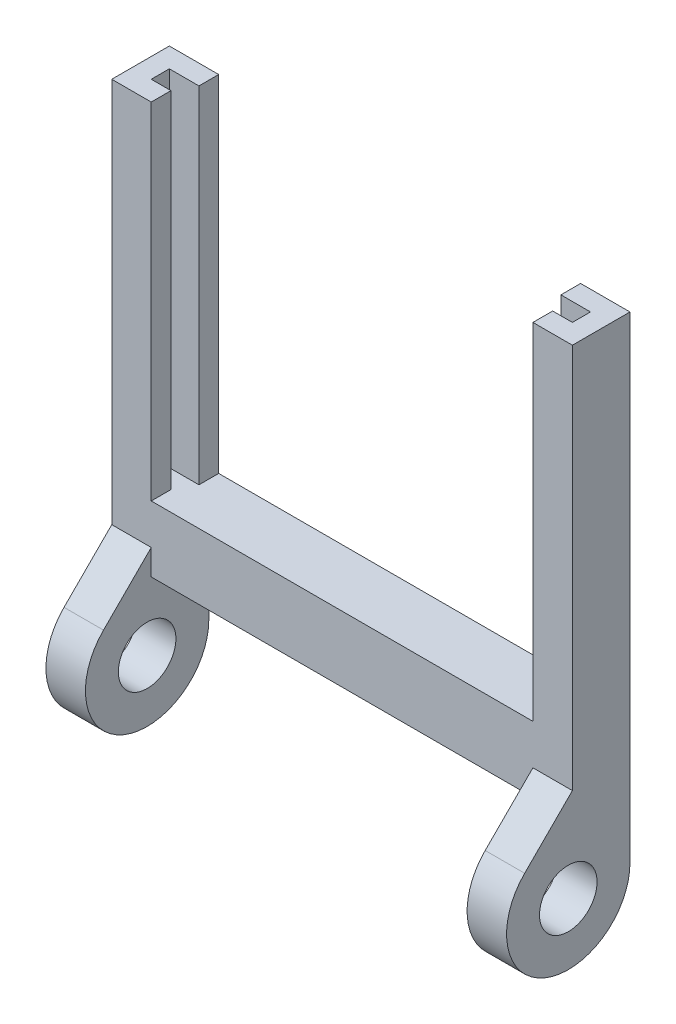
ISO-10303-21;
HEADER;
FILE_DESCRIPTION(('STEP AP214'),'2;1');
FILE_NAME('part.step','',(''),(''),'','','');
FILE_SCHEMA(('AUTOMOTIVE_DESIGN { 1 0 10303 214 1 1 1 1 }'));
ENDSEC;
DATA;
#1=APPLICATION_CONTEXT('core data for automotive mechanical design processes');
#2=APPLICATION_PROTOCOL_DEFINITION('international standard','automotive_design',2000,#1);
#3=PRODUCT_CONTEXT('',#1,'mechanical');
#4=PRODUCT('Part','Part','',(#3));
#5=PRODUCT_RELATED_PRODUCT_CATEGORY('part','',(#4));
#6=PRODUCT_DEFINITION_FORMATION('','',#4);
#7=PRODUCT_DEFINITION_CONTEXT('part definition',#1,'design');
#8=PRODUCT_DEFINITION('design','',#6,#7);
#9=PRODUCT_DEFINITION_SHAPE('','',#8);
#10=(LENGTH_UNIT() NAMED_UNIT(*) SI_UNIT(.MILLI.,.METRE.));
#11=(NAMED_UNIT(*) PLANE_ANGLE_UNIT() SI_UNIT($,.RADIAN.));
#12=(NAMED_UNIT(*) SI_UNIT($,.STERADIAN.) SOLID_ANGLE_UNIT());
#13=UNCERTAINTY_MEASURE_WITH_UNIT(LENGTH_MEASURE(1.E-05),#10,'distance_accuracy_value','');
#14=(GEOMETRIC_REPRESENTATION_CONTEXT(3) GLOBAL_UNCERTAINTY_ASSIGNED_CONTEXT((#13)) GLOBAL_UNIT_ASSIGNED_CONTEXT((#10,
#11,#12)) REPRESENTATION_CONTEXT('',''));
#15=CARTESIAN_POINT('',(0.,0.,0.));
#16=DIRECTION('',(0.,0.,1.));
#17=DIRECTION('',(1.,0.,0.));
#18=AXIS2_PLACEMENT_3D('',#15,#16,#17);
#19=CARTESIAN_POINT('',(0.,0.,1.2));
#20=DIRECTION('',(0.,0.,-1.));
#21=DIRECTION('',(-1.,0.,0.));
#22=AXIS2_PLACEMENT_3D('',#19,#20,#21);
#23=PLANE('',#22);
#24=DIRECTION('',(-1.,0.,0.));
#25=VECTOR('',#24,1.);
#26=CARTESIAN_POINT('',(-14.,-8.5,1.2));
#27=LINE('',#26,#25);
#28=CARTESIAN_POINT('',(12.8,-8.5,1.2));
#29=VERTEX_POINT('',#28);
#30=CARTESIAN_POINT('',(11.,-8.5,1.2));
#31=VERTEX_POINT('',#30);
#32=EDGE_CURVE('E222',#29,#31,#27,.T.);
#33=ORIENTED_EDGE('',*,*,#32,.F.);
#34=DIRECTION('',(0.,1.,0.));
#35=VECTOR('',#34,1.);
#36=CARTESIAN_POINT('',(12.8,-13.9708531688199,1.2));
#37=LINE('',#36,#35);
#38=CARTESIAN_POINT('',(12.8,12.5,1.2));
#39=VERTEX_POINT('',#38);
#40=EDGE_CURVE('E308',#29,#39,#37,.T.);
#41=ORIENTED_EDGE('',*,*,#40,.T.);
#42=DIRECTION('',(-1.,0.,0.));
#43=VECTOR('',#42,1.);
#44=CARTESIAN_POINT('',(-14.,12.5,1.2));
#45=LINE('',#44,#43);
#46=CARTESIAN_POINT('',(11.,12.5,1.2));
#47=VERTEX_POINT('',#46);
#48=EDGE_CURVE('E372',#39,#47,#45,.T.);
#49=ORIENTED_EDGE('',*,*,#48,.T.);
#50=DIRECTION('',(0.,1.,0.));
#51=VECTOR('',#50,1.);
#52=CARTESIAN_POINT('',(11.,12.5,1.2));
#53=LINE('',#52,#51);
#54=EDGE_CURVE('E351',#31,#47,#53,.T.);
#55=ORIENTED_EDGE('',*,*,#54,.F.);
#56=EDGE_LOOP('',(#33,#41,#49,#55));
#57=FACE_BOUND('',#56,.T.);
#58=ADVANCED_FACE('F37',(#57),#23,.F.);
#59=CARTESIAN_POINT('',(-11.,-8.5,1.2));
#60=VERTEX_POINT('',#59);
#61=CARTESIAN_POINT('',(-12.8,-8.5,1.2));
#62=VERTEX_POINT('',#61);
#63=EDGE_CURVE('E216',#60,#62,#27,.T.);
#64=ORIENTED_EDGE('',*,*,#63,.F.);
#65=DIRECTION('',(0.,-1.,0.));
#66=VECTOR('',#65,1.);
#67=CARTESIAN_POINT('',(-11.,12.5,1.2));
#68=LINE('',#67,#66);
#69=CARTESIAN_POINT('',(-11.,12.5,1.2));
#70=VERTEX_POINT('',#69);
#71=EDGE_CURVE('E344',#70,#60,#68,.T.);
#72=ORIENTED_EDGE('',*,*,#71,.F.);
#73=CARTESIAN_POINT('',(-12.8,12.5,1.2));
#74=VERTEX_POINT('',#73);
#75=EDGE_CURVE('E376',#70,#74,#45,.T.);
#76=ORIENTED_EDGE('',*,*,#75,.T.);
#77=DIRECTION('',(0.,1.,0.));
#78=VECTOR('',#77,1.);
#79=CARTESIAN_POINT('',(-12.8,-13.9708531688199,1.2));
#80=LINE('',#79,#78);
#81=EDGE_CURVE('E201',#62,#74,#80,.T.);
#82=ORIENTED_EDGE('',*,*,#81,.F.);
#83=EDGE_LOOP('',(#64,#72,#76,#82));
#84=FACE_BOUND('',#83,.T.);
#85=ADVANCED_FACE('F441',(#84),#23,.F.);
#86=CARTESIAN_POINT('',(11.6,-13.8483495705504,6.40165042944954));
#87=DIRECTION('',(0.,0.707106781186551,0.707106781186544));
#88=DIRECTION('',(0.,-0.707106781186544,0.707106781186551));
#89=AXIS2_PLACEMENT_3D('',#86,#87,#88);
#90=PLANE('',#89);
#91=DIRECTION('',(0.,-0.707106781186544,0.707106781186551));
#92=VECTOR('',#91,1.);
#93=CARTESIAN_POINT('',(14.,-13.8483495705504,6.40165042944954));
#94=LINE('',#93,#92);
#95=CARTESIAN_POINT('',(14.,-10.9466991411009,3.5));
#96=VERTEX_POINT('',#95);
#97=CARTESIAN_POINT('',(14.,-13.8483495705504,6.40165042944954));
#98=VERTEX_POINT('',#97);
#99=EDGE_CURVE('E324',#96,#98,#94,.T.);
#100=ORIENTED_EDGE('',*,*,#99,.F.);
#101=DIRECTION('',(-1.,0.,0.));
#102=VECTOR('',#101,1.);
#103=CARTESIAN_POINT('',(11.6,-10.9466991411009,3.5));
#104=LINE('',#103,#102);
#105=CARTESIAN_POINT('',(11.6,-10.9466991411009,3.5));
#106=VERTEX_POINT('',#105);
#107=EDGE_CURVE('E247',#96,#106,#104,.T.);
#108=ORIENTED_EDGE('',*,*,#107,.T.);
#109=DIRECTION('',(0.,-0.707106781186544,0.707106781186551));
#110=VECTOR('',#109,1.);
#111=CARTESIAN_POINT('',(11.6,-13.8483495705504,6.40165042944954));
#112=LINE('',#111,#110);
#113=CARTESIAN_POINT('',(11.6,-13.8483495705504,6.40165042944954));
#114=VERTEX_POINT('',#113);
#115=EDGE_CURVE('E328',#106,#114,#112,.T.);
#116=ORIENTED_EDGE('',*,*,#115,.T.);
#117=DIRECTION('',(1.,0.,0.));
#118=VECTOR('',#117,1.);
#119=CARTESIAN_POINT('',(11.6,-13.8483495705504,6.40165042944954));
#120=LINE('',#119,#118);
#121=EDGE_CURVE('E337',#114,#98,#120,.T.);
#122=ORIENTED_EDGE('',*,*,#121,.T.);
#123=EDGE_LOOP('',(#100,#108,#116,#122));
#124=FACE_BOUND('',#123,.T.);
#125=ADVANCED_FACE('F466',(#124),#90,.T.);
#126=CARTESIAN_POINT('',(11.6,-16.5,3.75));
#127=DIRECTION('',(1.,0.,0.));
#128=DIRECTION('',(0.,0.,-1.));
#129=AXIS2_PLACEMENT_3D('',#126,#127,#128);
#130=PLANE('',#129);
#131=DIRECTION('',(0.,0.,-1.));
#132=VECTOR('',#131,1.);
#133=CARTESIAN_POINT('',(11.6,-8.5,3.75));
#134=LINE('',#133,#132);
#135=CARTESIAN_POINT('',(11.6,-8.5,3.5));
#136=VERTEX_POINT('',#135);
#137=CARTESIAN_POINT('',(11.6,-8.5,2.3));
#138=VERTEX_POINT('',#137);
#139=EDGE_CURVE('E235',#136,#138,#134,.T.);
#140=ORIENTED_EDGE('',*,*,#139,.F.);
#141=DIRECTION('',(0.,1.,0.));
#142=VECTOR('',#141,1.);
#143=CARTESIAN_POINT('',(11.6,-13.9708531688199,3.5));
#144=LINE('',#143,#142);
#145=CARTESIAN_POINT('',(11.6,12.5,3.5));
#146=VERTEX_POINT('',#145);
#147=EDGE_CURVE('E311',#136,#146,#144,.T.);
#148=ORIENTED_EDGE('',*,*,#147,.T.);
#149=DIRECTION('',(0.,0.,1.));
#150=VECTOR('',#149,1.);
#151=CARTESIAN_POINT('',(11.6,12.5,3.5));
#152=LINE('',#151,#150);
#153=CARTESIAN_POINT('',(11.6,12.5,2.3));
#154=VERTEX_POINT('',#153);
#155=EDGE_CURVE('E300',#154,#146,#152,.T.);
#156=ORIENTED_EDGE('',*,*,#155,.F.);
#157=DIRECTION('',(0.,1.,0.));
#158=VECTOR('',#157,1.);
#159=CARTESIAN_POINT('',(11.6,-13.9708531688199,2.3));
#160=LINE('',#159,#158);
#161=EDGE_CURVE('E314',#138,#154,#160,.T.);
#162=ORIENTED_EDGE('',*,*,#161,.F.);
#163=EDGE_LOOP('',(#140,#148,#156,#162));
#164=FACE_BOUND('',#163,.T.);
#165=ADVANCED_FACE('F463',(#164),#130,.F.);
#166=CARTESIAN_POINT('',(11.6,-16.5,3.75));
#167=DIRECTION('',(1.,0.,0.));
#168=DIRECTION('',(0.,0.,-1.));
#169=AXIS2_PLACEMENT_3D('',#166,#167,#168);
#170=CIRCLE('',#169,1.75);
#171=CARTESIAN_POINT('',(11.6,-16.5,2.));
#172=VERTEX_POINT('',#171);
#173=EDGE_CURVE('E321',#172,#172,#170,.T.);
#174=ORIENTED_EDGE('',*,*,#173,.T.);
#175=EDGE_LOOP('',(#174));
#176=FACE_BOUND('',#175,.T.);
#177=DIRECTION('',(0.,1.,0.));
#178=VECTOR('',#177,1.);
#179=CARTESIAN_POINT('',(11.6,-16.5,3.5));
#180=LINE('',#179,#178);
#181=CARTESIAN_POINT('',(11.6,-12.5,3.5));
#182=VERTEX_POINT('',#181);
#183=EDGE_CURVE('E242',#182,#106,#180,.T.);
#184=ORIENTED_EDGE('',*,*,#183,.F.);
#185=DIRECTION('',(0.,0.,1.));
#186=VECTOR('',#185,1.);
#187=CARTESIAN_POINT('',(11.6,-12.5,0.));
#188=LINE('',#187,#186);
#189=CARTESIAN_POINT('',(11.6,-12.5,0.));
#190=VERTEX_POINT('',#189);
#191=EDGE_CURVE('E60',#190,#182,#188,.T.);
#192=ORIENTED_EDGE('',*,*,#191,.F.);
#193=DIRECTION('',(0.,1.,0.));
#194=VECTOR('',#193,1.);
#195=CARTESIAN_POINT('',(11.6,-12.5,0.));
#196=LINE('',#195,#194);
#197=CARTESIAN_POINT('',(11.6,-16.5,0.));
#198=VERTEX_POINT('',#197);
#199=EDGE_CURVE('E334',#198,#190,#196,.T.);
#200=ORIENTED_EDGE('',*,*,#199,.F.);
#201=CARTESIAN_POINT('',(11.6,-16.5,3.75));
#202=DIRECTION('',(1.,0.,0.));
#203=DIRECTION('',(0.,0.,-1.));
#204=AXIS2_PLACEMENT_3D('',#201,#202,#203);
#205=CIRCLE('',#204,3.75);
#206=EDGE_CURVE('E331',#114,#198,#205,.T.);
#207=ORIENTED_EDGE('',*,*,#206,.F.);
#208=ORIENTED_EDGE('',*,*,#115,.F.);
#209=EDGE_LOOP('',(#184,#192,#200,#207,#208));
#210=FACE_BOUND('',#209,.T.);
#211=ADVANCED_FACE('F406',(#176,#210),#130,.F.);
#212=CARTESIAN_POINT('',(11.6,-13.9708531688199,2.3));
#213=DIRECTION('',(0.,0.,-1.));
#214=DIRECTION('',(-1.,0.,0.));
#215=AXIS2_PLACEMENT_3D('',#212,#213,#214);
#216=PLANE('',#215);
#217=DIRECTION('',(0.,1.,0.));
#218=VECTOR('',#217,1.);
#219=CARTESIAN_POINT('',(12.8,-13.9708531688199,2.3));
#220=LINE('',#219,#218);
#221=CARTESIAN_POINT('',(12.8,-8.5,2.3));
#222=VERTEX_POINT('',#221);
#223=CARTESIAN_POINT('',(12.8,12.5,2.3));
#224=VERTEX_POINT('',#223);
#225=EDGE_CURVE('E317',#222,#224,#220,.T.);
#226=ORIENTED_EDGE('',*,*,#225,.F.);
#227=DIRECTION('',(-1.,0.,0.));
#228=VECTOR('',#227,1.);
#229=CARTESIAN_POINT('',(11.6,-8.5,2.3));
#230=LINE('',#229,#228);
#231=EDGE_CURVE('E233',#222,#138,#230,.T.);
#232=ORIENTED_EDGE('',*,*,#231,.T.);
#233=ORIENTED_EDGE('',*,*,#161,.T.);
#234=DIRECTION('',(-1.,0.,0.));
#235=VECTOR('',#234,1.);
#236=CARTESIAN_POINT('',(11.6,12.5,2.3));
#237=LINE('',#236,#235);
#238=EDGE_CURVE('E296',#224,#154,#237,.T.);
#239=ORIENTED_EDGE('',*,*,#238,.F.);
#240=EDGE_LOOP('',(#226,#232,#233,#239));
#241=FACE_BOUND('',#240,.T.);
#242=ADVANCED_FACE('F459',(#241),#216,.T.);
#243=CARTESIAN_POINT('',(12.8,-13.9708531688199,2.3));
#244=DIRECTION('',(-1.,0.,0.));
#245=DIRECTION('',(0.,0.,1.));
#246=AXIS2_PLACEMENT_3D('',#243,#244,#245);
#247=PLANE('',#246);
#248=ORIENTED_EDGE('',*,*,#40,.F.);
#249=DIRECTION('',(0.,0.,1.));
#250=VECTOR('',#249,1.);
#251=CARTESIAN_POINT('',(12.8,-8.5,2.3));
#252=LINE('',#251,#250);
#253=EDGE_CURVE('E231',#29,#222,#252,.T.);
#254=ORIENTED_EDGE('',*,*,#253,.T.);
#255=ORIENTED_EDGE('',*,*,#225,.T.);
#256=DIRECTION('',(0.,0.,1.));
#257=VECTOR('',#256,1.);
#258=CARTESIAN_POINT('',(12.8,12.5,2.3));
#259=LINE('',#258,#257);
#260=EDGE_CURVE('E290',#39,#224,#259,.T.);
#261=ORIENTED_EDGE('',*,*,#260,.F.);
#262=EDGE_LOOP('',(#248,#254,#255,#261));
#263=FACE_BOUND('',#262,.T.);
#264=ADVANCED_FACE('F454',(#263),#247,.T.);
#265=CARTESIAN_POINT('',(-11.6,-16.5,3.75));
#266=DIRECTION('',(-1.,0.,0.));
#267=DIRECTION('',(0.,0.,-1.));
#268=AXIS2_PLACEMENT_3D('',#265,#266,#267);
#269=PLANE('',#268);
#270=DIRECTION('',(0.,0.,1.));
#271=VECTOR('',#270,1.);
#272=CARTESIAN_POINT('',(-11.6,-8.5,3.75));
#273=LINE('',#272,#271);
#274=CARTESIAN_POINT('',(-11.6,-8.5,2.3));
#275=VERTEX_POINT('',#274);
#276=CARTESIAN_POINT('',(-11.6,-8.5,3.5));
#277=VERTEX_POINT('',#276);
#278=EDGE_CURVE('E210',#275,#277,#273,.T.);
#279=ORIENTED_EDGE('',*,*,#278,.F.);
#280=DIRECTION('',(0.,1.,0.));
#281=VECTOR('',#280,1.);
#282=CARTESIAN_POINT('',(-11.6,-13.9708531688199,2.3));
#283=LINE('',#282,#281);
#284=CARTESIAN_POINT('',(-11.6,12.5,2.3));
#285=VERTEX_POINT('',#284);
#286=EDGE_CURVE('E202',#275,#285,#283,.T.);
#287=ORIENTED_EDGE('',*,*,#286,.T.);
#288=DIRECTION('',(0.,0.,1.));
#289=VECTOR('',#288,1.);
#290=CARTESIAN_POINT('',(-11.6,12.5,3.5));
#291=LINE('',#290,#289);
#292=CARTESIAN_POINT('',(-11.6,12.5,3.5));
#293=VERTEX_POINT('',#292);
#294=EDGE_CURVE('E252',#285,#293,#291,.T.);
#295=ORIENTED_EDGE('',*,*,#294,.T.);
#296=DIRECTION('',(0.,1.,0.));
#297=VECTOR('',#296,1.);
#298=CARTESIAN_POINT('',(-11.6,-13.9708531688199,3.5));
#299=LINE('',#298,#297);
#300=EDGE_CURVE('E263',#277,#293,#299,.T.);
#301=ORIENTED_EDGE('',*,*,#300,.F.);
#302=EDGE_LOOP('',(#279,#287,#295,#301));
#303=FACE_BOUND('',#302,.T.);
#304=ADVANCED_FACE('F439',(#303),#269,.F.);
#305=CARTESIAN_POINT('',(-11.6,-16.5,3.75));
#306=DIRECTION('',(1.,0.,0.));
#307=DIRECTION('',(0.,0.,-1.));
#308=AXIS2_PLACEMENT_3D('',#305,#306,#307);
#309=CIRCLE('',#308,1.75);
#310=CARTESIAN_POINT('',(-11.6,-16.5,2.));
#311=VERTEX_POINT('',#310);
#312=EDGE_CURVE('E267',#311,#311,#309,.T.);
#313=ORIENTED_EDGE('',*,*,#312,.F.);
#314=EDGE_LOOP('',(#313));
#315=FACE_BOUND('',#314,.T.);
#316=DIRECTION('',(0.,0.,1.));
#317=VECTOR('',#316,1.);
#318=CARTESIAN_POINT('',(-11.6,-12.5,0.));
#319=LINE('',#318,#317);
#320=CARTESIAN_POINT('',(-11.6,-12.5,0.));
#321=VERTEX_POINT('',#320);
#322=CARTESIAN_POINT('',(-11.6,-12.5,3.5));
#323=VERTEX_POINT('',#322);
#324=EDGE_CURVE('E273',#321,#323,#319,.T.);
#325=ORIENTED_EDGE('',*,*,#324,.T.);
#326=DIRECTION('',(0.,-1.,0.));
#327=VECTOR('',#326,1.);
#328=CARTESIAN_POINT('',(-11.6,-16.5,3.5));
#329=LINE('',#328,#327);
#330=CARTESIAN_POINT('',(-11.6,-10.9466991411009,3.5));
#331=VERTEX_POINT('',#330);
#332=EDGE_CURVE('E239',#331,#323,#329,.T.);
#333=ORIENTED_EDGE('',*,*,#332,.F.);
#334=DIRECTION('',(0.,-0.707106781186544,0.707106781186551));
#335=VECTOR('',#334,1.);
#336=CARTESIAN_POINT('',(-11.6,-13.8483495705504,6.40165042944954));
#337=LINE('',#336,#335);
#338=CARTESIAN_POINT('',(-11.6,-13.8483495705504,6.40165042944954));
#339=VERTEX_POINT('',#338);
#340=EDGE_CURVE('E281',#331,#339,#337,.T.);
#341=ORIENTED_EDGE('',*,*,#340,.T.);
#342=CARTESIAN_POINT('',(-11.6,-16.5,3.75));
#343=DIRECTION('',(1.,0.,0.));
#344=DIRECTION('',(0.,0.,-1.));
#345=AXIS2_PLACEMENT_3D('',#342,#343,#344);
#346=CIRCLE('',#345,3.75);
#347=CARTESIAN_POINT('',(-11.6,-16.5,0.));
#348=VERTEX_POINT('',#347);
#349=EDGE_CURVE('E279',#339,#348,#346,.T.);
#350=ORIENTED_EDGE('',*,*,#349,.T.);
#351=DIRECTION('',(0.,1.,0.));
#352=VECTOR('',#351,1.);
#353=CARTESIAN_POINT('',(-11.6,-12.5,0.));
#354=LINE('',#353,#352);
#355=EDGE_CURVE('E275',#348,#321,#354,.T.);
#356=ORIENTED_EDGE('',*,*,#355,.T.);
#357=EDGE_LOOP('',(#325,#333,#341,#350,#356));
#358=FACE_BOUND('',#357,.T.);
#359=ADVANCED_FACE('F412',(#315,#358),#269,.F.);
#360=CARTESIAN_POINT('',(-11.6,-13.8483495705504,6.40165042944954));
#361=DIRECTION('',(0.,-0.707106781186551,-0.707106781186544));
#362=DIRECTION('',(0.,0.707106781186544,-0.707106781186551));
#363=AXIS2_PLACEMENT_3D('',#360,#361,#362);
#364=PLANE('',#363);
#365=DIRECTION('',(1.,0.,0.));
#366=VECTOR('',#365,1.);
#367=CARTESIAN_POINT('',(-11.6,-10.9466991411009,3.5));
#368=LINE('',#367,#366);
#369=CARTESIAN_POINT('',(-14.,-10.9466991411009,3.5));
#370=VERTEX_POINT('',#369);
#371=EDGE_CURVE('E238',#370,#331,#368,.T.);
#372=ORIENTED_EDGE('',*,*,#371,.F.);
#373=DIRECTION('',(0.,-0.707106781186544,0.707106781186551));
#374=VECTOR('',#373,1.);
#375=CARTESIAN_POINT('',(-14.,-13.8483495705504,6.40165042944954));
#376=LINE('',#375,#374);
#377=CARTESIAN_POINT('',(-14.,-13.8483495705504,6.40165042944954));
#378=VERTEX_POINT('',#377);
#379=EDGE_CURVE('E276',#370,#378,#376,.T.);
#380=ORIENTED_EDGE('',*,*,#379,.T.);
#381=DIRECTION('',(-1.,0.,0.));
#382=VECTOR('',#381,1.);
#383=CARTESIAN_POINT('',(-11.6,-13.8483495705504,6.40165042944954));
#384=LINE('',#383,#382);
#385=EDGE_CURVE('E287',#339,#378,#384,.T.);
#386=ORIENTED_EDGE('',*,*,#385,.F.);
#387=ORIENTED_EDGE('',*,*,#340,.F.);
#388=EDGE_LOOP('',(#372,#380,#386,#387));
#389=FACE_BOUND('',#388,.T.);
#390=ADVANCED_FACE('F468',(#389),#364,.F.);
#391=CARTESIAN_POINT('',(-11.6,-13.9708531688199,2.3));
#392=DIRECTION('',(0.,0.,1.));
#393=DIRECTION('',(1.,0.,0.));
#394=AXIS2_PLACEMENT_3D('',#391,#392,#393);
#395=PLANE('',#394);
#396=DIRECTION('',(1.,0.,0.));
#397=VECTOR('',#396,1.);
#398=CARTESIAN_POINT('',(-11.6,-8.5,2.3));
#399=LINE('',#398,#397);
#400=CARTESIAN_POINT('',(-12.8,-8.5,2.3));
#401=VERTEX_POINT('',#400);
#402=EDGE_CURVE('E206',#401,#275,#399,.T.);
#403=ORIENTED_EDGE('',*,*,#402,.F.);
#404=DIRECTION('',(0.,1.,0.));
#405=VECTOR('',#404,1.);
#406=CARTESIAN_POINT('',(-12.8,-13.9708531688199,2.3));
#407=LINE('',#406,#405);
#408=CARTESIAN_POINT('',(-12.8,12.5,2.3));
#409=VERTEX_POINT('',#408);
#410=EDGE_CURVE('E192',#401,#409,#407,.T.);
#411=ORIENTED_EDGE('',*,*,#410,.T.);
#412=DIRECTION('',(1.,0.,0.));
#413=VECTOR('',#412,1.);
#414=CARTESIAN_POINT('',(-11.6,12.5,2.3));
#415=LINE('',#414,#413);
#416=EDGE_CURVE('E255',#409,#285,#415,.T.);
#417=ORIENTED_EDGE('',*,*,#416,.T.);
#418=ORIENTED_EDGE('',*,*,#286,.F.);
#419=EDGE_LOOP('',(#403,#411,#417,#418));
#420=FACE_BOUND('',#419,.T.);
#421=ADVANCED_FACE('F207',(#420),#395,.F.);
#422=CARTESIAN_POINT('',(-12.8,-13.9708531688199,2.3));
#423=DIRECTION('',(-1.,0.,0.));
#424=DIRECTION('',(0.,0.,1.));
#425=AXIS2_PLACEMENT_3D('',#422,#423,#424);
#426=PLANE('',#425);
#427=DIRECTION('',(0.,0.,1.));
#428=VECTOR('',#427,1.);
#429=CARTESIAN_POINT('',(-12.8,-8.5,2.3));
#430=LINE('',#429,#428);
#431=EDGE_CURVE('E11',#62,#401,#430,.T.);
#432=ORIENTED_EDGE('',*,*,#431,.F.);
#433=ORIENTED_EDGE('',*,*,#81,.T.);
#434=DIRECTION('',(0.,0.,1.));
#435=VECTOR('',#434,1.);
#436=CARTESIAN_POINT('',(-12.8,12.5,2.3));
#437=LINE('',#436,#435);
#438=EDGE_CURVE('E197',#74,#409,#437,.T.);
#439=ORIENTED_EDGE('',*,*,#438,.T.);
#440=ORIENTED_EDGE('',*,*,#410,.F.);
#441=EDGE_LOOP('',(#432,#433,#439,#440));
#442=FACE_BOUND('',#441,.T.);
#443=ADVANCED_FACE('F194',(#442),#426,.F.);
#444=CARTESIAN_POINT('',(-14.,-12.5,1.2));
#445=DIRECTION('',(0.,1.,0.));
#446=DIRECTION('',(0.,0.,1.));
#447=AXIS2_PLACEMENT_3D('',#444,#445,#446);
#448=PLANE('',#447);
#449=ORIENTED_EDGE('',*,*,#324,.F.);
#450=DIRECTION('',(1.,0.,0.));
#451=VECTOR('',#450,1.);
#452=CARTESIAN_POINT('',(-14.,-12.5,0.));
#453=LINE('',#452,#451);
#454=EDGE_CURVE('E387',#321,#190,#453,.T.);
#455=ORIENTED_EDGE('',*,*,#454,.T.);
#456=ORIENTED_EDGE('',*,*,#191,.T.);
#457=DIRECTION('',(-1.,0.,0.));
#458=VECTOR('',#457,1.);
#459=CARTESIAN_POINT('',(-14.,-12.5,3.5));
#460=LINE('',#459,#458);
#461=EDGE_CURVE('E211',#182,#323,#460,.T.);
#462=ORIENTED_EDGE('',*,*,#461,.T.);
#463=EDGE_LOOP('',(#449,#455,#456,#462));
#464=FACE_BOUND('',#463,.T.);
#465=ADVANCED_FACE('F409',(#464),#448,.F.);
#466=CARTESIAN_POINT('',(-14.,12.5,1.2));
#467=DIRECTION('',(0.,-1.,0.));
#468=DIRECTION('',(0.,0.,-1.));
#469=AXIS2_PLACEMENT_3D('',#466,#467,#468);
#470=PLANE('',#469);
#471=ORIENTED_EDGE('',*,*,#75,.F.);
#472=DIRECTION('',(0.,0.,1.));
#473=VECTOR('',#472,1.);
#474=CARTESIAN_POINT('',(-11.,12.5,0.));
#475=LINE('',#474,#473);
#476=CARTESIAN_POINT('',(-11.,12.5,0.));
#477=VERTEX_POINT('',#476);
#478=EDGE_CURVE('E362',#477,#70,#475,.T.);
#479=ORIENTED_EDGE('',*,*,#478,.F.);
#480=DIRECTION('',(-1.,0.,0.));
#481=VECTOR('',#480,1.);
#482=CARTESIAN_POINT('',(-14.,12.5,0.));
#483=LINE('',#482,#481);
#484=CARTESIAN_POINT('',(-14.,12.5,0.));
#485=VERTEX_POINT('',#484);
#486=EDGE_CURVE('E380',#477,#485,#483,.T.);
#487=ORIENTED_EDGE('',*,*,#486,.T.);
#488=DIRECTION('',(0.,0.,-1.));
#489=VECTOR('',#488,1.);
#490=CARTESIAN_POINT('',(-14.,12.5,1.2));
#491=LINE('',#490,#489);
#492=CARTESIAN_POINT('',(-14.,12.5,3.5));
#493=VERTEX_POINT('',#492);
#494=EDGE_CURVE('E375',#493,#485,#491,.T.);
#495=ORIENTED_EDGE('',*,*,#494,.F.);
#496=DIRECTION('',(-1.,0.,0.));
#497=VECTOR('',#496,1.);
#498=CARTESIAN_POINT('',(-14.,12.5,3.5));
#499=LINE('',#498,#497);
#500=EDGE_CURVE('E249',#293,#493,#499,.T.);
#501=ORIENTED_EDGE('',*,*,#500,.F.);
#502=ORIENTED_EDGE('',*,*,#294,.F.);
#503=ORIENTED_EDGE('',*,*,#416,.F.);
#504=ORIENTED_EDGE('',*,*,#438,.F.);
#505=EDGE_LOOP('',(#471,#479,#487,#495,#501,#502,#503,#504));
#506=FACE_BOUND('',#505,.T.);
#507=ADVANCED_FACE('F430',(#506),#470,.F.);
#508=CARTESIAN_POINT('',(14.,-12.5,1.2));
#509=DIRECTION('',(-1.,0.,0.));
#510=DIRECTION('',(0.,0.,1.));
#511=AXIS2_PLACEMENT_3D('',#508,#509,#510);
#512=PLANE('',#511);
#513=DIRECTION('',(0.,0.,-1.));
#514=VECTOR('',#513,1.);
#515=CARTESIAN_POINT('',(14.,12.5,1.2));
#516=LINE('',#515,#514);
#517=CARTESIAN_POINT('',(14.,12.5,3.5));
#518=VERTEX_POINT('',#517);
#519=CARTESIAN_POINT('',(14.,12.5,0.));
#520=VERTEX_POINT('',#519);
#521=EDGE_CURVE('E45',#518,#520,#516,.T.);
#522=ORIENTED_EDGE('',*,*,#521,.F.);
#523=DIRECTION('',(0.,1.,0.));
#524=VECTOR('',#523,1.);
#525=CARTESIAN_POINT('',(14.,-13.9708531688199,3.5));
#526=LINE('',#525,#524);
#527=EDGE_CURVE('E52',#96,#518,#526,.T.);
#528=ORIENTED_EDGE('',*,*,#527,.F.);
#529=ORIENTED_EDGE('',*,*,#99,.T.);
#530=CARTESIAN_POINT('',(14.,-16.5,3.75));
#531=DIRECTION('',(1.,0.,0.));
#532=DIRECTION('',(0.,0.,-1.));
#533=AXIS2_PLACEMENT_3D('',#530,#531,#532);
#534=CIRCLE('',#533,3.75);
#535=CARTESIAN_POINT('',(14.,-16.5,0.));
#536=VERTEX_POINT('',#535);
#537=EDGE_CURVE('E329',#98,#536,#534,.T.);
#538=ORIENTED_EDGE('',*,*,#537,.T.);
#539=DIRECTION('',(0.,1.,0.));
#540=VECTOR('',#539,1.);
#541=CARTESIAN_POINT('',(14.,-12.5,0.));
#542=LINE('',#541,#540);
#543=EDGE_CURVE('E364',#536,#520,#542,.T.);
#544=ORIENTED_EDGE('',*,*,#543,.T.);
#545=EDGE_LOOP('',(#522,#528,#529,#538,#544));
#546=FACE_BOUND('',#545,.T.);
#547=CARTESIAN_POINT('',(14.,-16.5,3.75));
#548=DIRECTION('',(1.,0.,0.));
#549=DIRECTION('',(0.,0.,-1.));
#550=AXIS2_PLACEMENT_3D('',#547,#548,#549);
#551=CIRCLE('',#550,1.75);
#552=CARTESIAN_POINT('',(14.,-16.5,2.));
#553=VERTEX_POINT('',#552);
#554=EDGE_CURVE('E310',#553,#553,#551,.T.);
#555=ORIENTED_EDGE('',*,*,#554,.F.);
#556=EDGE_LOOP('',(#555));
#557=FACE_BOUND('',#556,.T.);
#558=ADVANCED_FACE('F39',(#546,#557),#512,.F.);
#559=CARTESIAN_POINT('',(11.,12.5,0.));
#560=VERTEX_POINT('',#559);
#561=EDGE_CURVE('E381',#520,#560,#483,.T.);
#562=ORIENTED_EDGE('',*,*,#561,.T.);
#563=DIRECTION('',(0.,0.,1.));
#564=VECTOR('',#563,1.);
#565=CARTESIAN_POINT('',(11.,12.5,0.));
#566=LINE('',#565,#564);
#567=EDGE_CURVE('E365',#560,#47,#566,.T.);
#568=ORIENTED_EDGE('',*,*,#567,.T.);
#569=ORIENTED_EDGE('',*,*,#48,.F.);
#570=ORIENTED_EDGE('',*,*,#260,.T.);
#571=ORIENTED_EDGE('',*,*,#238,.T.);
#572=ORIENTED_EDGE('',*,*,#155,.T.);
#573=DIRECTION('',(1.,0.,0.));
#574=VECTOR('',#573,1.);
#575=CARTESIAN_POINT('',(14.,12.5,3.5));
#576=LINE('',#575,#574);
#577=EDGE_CURVE('E304',#146,#518,#576,.T.);
#578=ORIENTED_EDGE('',*,*,#577,.T.);
#579=ORIENTED_EDGE('',*,*,#521,.T.);
#580=EDGE_LOOP('',(#562,#568,#569,#570,#571,#572,#578,#579));
#581=FACE_BOUND('',#580,.T.);
#582=ADVANCED_FACE('F393',(#581),#470,.F.);
#583=CARTESIAN_POINT('',(-14.,-12.5,1.2));
#584=DIRECTION('',(1.,0.,0.));
#585=DIRECTION('',(0.,0.,-1.));
#586=AXIS2_PLACEMENT_3D('',#583,#584,#585);
#587=PLANE('',#586);
#588=DIRECTION('',(0.,1.,0.));
#589=VECTOR('',#588,1.);
#590=CARTESIAN_POINT('',(-14.,-13.9708531688199,3.5));
#591=LINE('',#590,#589);
#592=EDGE_CURVE('E258',#370,#493,#591,.T.);
#593=ORIENTED_EDGE('',*,*,#592,.T.);
#594=ORIENTED_EDGE('',*,*,#494,.T.);
#595=DIRECTION('',(0.,-1.,0.));
#596=VECTOR('',#595,1.);
#597=CARTESIAN_POINT('',(-14.,-12.5,0.));
#598=LINE('',#597,#596);
#599=CARTESIAN_POINT('',(-14.,-16.5,0.));
#600=VERTEX_POINT('',#599);
#601=EDGE_CURVE('E385',#485,#600,#598,.T.);
#602=ORIENTED_EDGE('',*,*,#601,.T.);
#603=CARTESIAN_POINT('',(-14.,-16.5,3.75));
#604=DIRECTION('',(1.,0.,0.));
#605=DIRECTION('',(0.,0.,-1.));
#606=AXIS2_PLACEMENT_3D('',#603,#604,#605);
#607=CIRCLE('',#606,3.75);
#608=EDGE_CURVE('E270',#378,#600,#607,.T.);
#609=ORIENTED_EDGE('',*,*,#608,.F.);
#610=ORIENTED_EDGE('',*,*,#379,.F.);
#611=EDGE_LOOP('',(#593,#594,#602,#609,#610));
#612=FACE_BOUND('',#611,.T.);
#613=CARTESIAN_POINT('',(-14.,-16.5,3.75));
#614=DIRECTION('',(1.,0.,0.));
#615=DIRECTION('',(0.,0.,-1.));
#616=AXIS2_PLACEMENT_3D('',#613,#614,#615);
#617=CIRCLE('',#616,1.75);
#618=CARTESIAN_POINT('',(-14.,-16.5,2.));
#619=VERTEX_POINT('',#618);
#620=EDGE_CURVE('E259',#619,#619,#617,.T.);
#621=ORIENTED_EDGE('',*,*,#620,.T.);
#622=EDGE_LOOP('',(#621));
#623=FACE_BOUND('',#622,.T.);
#624=ADVANCED_FACE('F423',(#612,#623),#587,.F.);
#625=CARTESIAN_POINT('',(0.,0.,0.));
#626=DIRECTION('',(0.,0.,-1.));
#627=DIRECTION('',(-1.,0.,0.));
#628=AXIS2_PLACEMENT_3D('',#625,#626,#627);
#629=PLANE('',#628);
#630=DIRECTION('',(0.,-1.,0.));
#631=VECTOR('',#630,1.);
#632=CARTESIAN_POINT('',(-11.,12.5,0.));
#633=LINE('',#632,#631);
#634=CARTESIAN_POINT('',(-11.,-8.5,0.));
#635=VERTEX_POINT('',#634);
#636=EDGE_CURVE('E347',#477,#635,#633,.T.);
#637=ORIENTED_EDGE('',*,*,#636,.T.);
#638=DIRECTION('',(1.,0.,0.));
#639=VECTOR('',#638,1.);
#640=CARTESIAN_POINT('',(-11.,-8.5,0.));
#641=LINE('',#640,#639);
#642=CARTESIAN_POINT('',(11.,-8.5,0.));
#643=VERTEX_POINT('',#642);
#644=EDGE_CURVE('E350',#635,#643,#641,.T.);
#645=ORIENTED_EDGE('',*,*,#644,.T.);
#646=DIRECTION('',(0.,1.,0.));
#647=VECTOR('',#646,1.);
#648=CARTESIAN_POINT('',(11.,12.5,0.));
#649=LINE('',#648,#647);
#650=EDGE_CURVE('E354',#643,#560,#649,.T.);
#651=ORIENTED_EDGE('',*,*,#650,.T.);
#652=ORIENTED_EDGE('',*,*,#561,.F.);
#653=ORIENTED_EDGE('',*,*,#543,.F.);
#654=DIRECTION('',(1.,0.,0.));
#655=VECTOR('',#654,1.);
#656=CARTESIAN_POINT('',(11.6,-16.5,0.));
#657=LINE('',#656,#655);
#658=EDGE_CURVE('E341',#198,#536,#657,.T.);
#659=ORIENTED_EDGE('',*,*,#658,.F.);
#660=ORIENTED_EDGE('',*,*,#199,.T.);
#661=ORIENTED_EDGE('',*,*,#454,.F.);
#662=ORIENTED_EDGE('',*,*,#355,.F.);
#663=DIRECTION('',(-1.,0.,0.));
#664=VECTOR('',#663,1.);
#665=CARTESIAN_POINT('',(-11.6,-16.5,0.));
#666=LINE('',#665,#664);
#667=EDGE_CURVE('E283',#348,#600,#666,.T.);
#668=ORIENTED_EDGE('',*,*,#667,.T.);
#669=ORIENTED_EDGE('',*,*,#601,.F.);
#670=ORIENTED_EDGE('',*,*,#486,.F.);
#671=EDGE_LOOP('',(#637,#645,#651,#652,#653,#659,#660,#661,#662,#668,#669,#670));
#672=FACE_BOUND('',#671,.T.);
#673=ADVANCED_FACE('F398',(#672),#629,.T.);
#674=CARTESIAN_POINT('',(-11.,12.5,0.));
#675=DIRECTION('',(-1.,0.,0.));
#676=DIRECTION('',(0.,-1.,0.));
#677=AXIS2_PLACEMENT_3D('',#674,#675,#676);
#678=PLANE('',#677);
#679=ORIENTED_EDGE('',*,*,#71,.T.);
#680=DIRECTION('',(0.,0.,1.));
#681=VECTOR('',#680,1.);
#682=CARTESIAN_POINT('',(-11.,-8.5,0.));
#683=LINE('',#682,#681);
#684=EDGE_CURVE('E218',#635,#60,#683,.T.);
#685=ORIENTED_EDGE('',*,*,#684,.F.);
#686=ORIENTED_EDGE('',*,*,#636,.F.);
#687=ORIENTED_EDGE('',*,*,#478,.T.);
#688=EDGE_LOOP('',(#679,#685,#686,#687));
#689=FACE_BOUND('',#688,.T.);
#690=ADVANCED_FACE('F443',(#689),#678,.F.);
#691=CARTESIAN_POINT('',(11.,12.5,0.));
#692=DIRECTION('',(1.,0.,0.));
#693=DIRECTION('',(0.,1.,0.));
#694=AXIS2_PLACEMENT_3D('',#691,#692,#693);
#695=PLANE('',#694);
#696=ORIENTED_EDGE('',*,*,#54,.T.);
#697=ORIENTED_EDGE('',*,*,#567,.F.);
#698=ORIENTED_EDGE('',*,*,#650,.F.);
#699=DIRECTION('',(0.,0.,1.));
#700=VECTOR('',#699,1.);
#701=CARTESIAN_POINT('',(11.,-8.5,0.));
#702=LINE('',#701,#700);
#703=EDGE_CURVE('E369',#643,#31,#702,.T.);
#704=ORIENTED_EDGE('',*,*,#703,.T.);
#705=EDGE_LOOP('',(#696,#697,#698,#704));
#706=FACE_BOUND('',#705,.T.);
#707=ADVANCED_FACE('F448',(#706),#695,.F.);
#708=CARTESIAN_POINT('',(-11.,-8.5,0.));
#709=DIRECTION('',(0.,-1.,0.));
#710=DIRECTION('',(0.,0.,-1.));
#711=AXIS2_PLACEMENT_3D('',#708,#709,#710);
#712=PLANE('',#711);
#713=ORIENTED_EDGE('',*,*,#684,.T.);
#714=ORIENTED_EDGE('',*,*,#63,.T.);
#715=ORIENTED_EDGE('',*,*,#431,.T.);
#716=ORIENTED_EDGE('',*,*,#402,.T.);
#717=ORIENTED_EDGE('',*,*,#278,.T.);
#718=DIRECTION('',(1.,0.,0.));
#719=VECTOR('',#718,1.);
#720=CARTESIAN_POINT('',(-14.,-8.5,3.5));
#721=LINE('',#720,#719);
#722=EDGE_CURVE('E225',#277,#136,#721,.T.);
#723=ORIENTED_EDGE('',*,*,#722,.T.);
#724=ORIENTED_EDGE('',*,*,#139,.T.);
#725=ORIENTED_EDGE('',*,*,#231,.F.);
#726=ORIENTED_EDGE('',*,*,#253,.F.);
#727=ORIENTED_EDGE('',*,*,#32,.T.);
#728=ORIENTED_EDGE('',*,*,#703,.F.);
#729=ORIENTED_EDGE('',*,*,#644,.F.);
#730=EDGE_LOOP('',(#713,#714,#715,#716,#717,#723,#724,#725,#726,#727,#728,#729));
#731=FACE_BOUND('',#730,.T.);
#732=ADVANCED_FACE('F215',(#731),#712,.F.);
#733=CARTESIAN_POINT('',(11.6,-16.5,3.75));
#734=DIRECTION('',(1.,0.,0.));
#735=DIRECTION('',(0.,0.,-1.));
#736=AXIS2_PLACEMENT_3D('',#733,#734,#735);
#737=CYLINDRICAL_SURFACE('',#736,3.75);
#738=ORIENTED_EDGE('',*,*,#537,.F.);
#739=ORIENTED_EDGE('',*,*,#121,.F.);
#740=ORIENTED_EDGE('',*,*,#206,.T.);
#741=ORIENTED_EDGE('',*,*,#658,.T.);
#742=EDGE_LOOP('',(#738,#739,#740,#741));
#743=FACE_BOUND('',#742,.T.);
#744=ADVANCED_FACE('F400',(#743),#737,.T.);
#745=CARTESIAN_POINT('',(11.6,-16.5,3.75));
#746=DIRECTION('',(1.,0.,0.));
#747=DIRECTION('',(0.,0.,-1.));
#748=AXIS2_PLACEMENT_3D('',#745,#746,#747);
#749=CYLINDRICAL_SURFACE('',#748,1.75);
#750=ORIENTED_EDGE('',*,*,#173,.F.);
#751=EDGE_LOOP('',(#750));
#752=FACE_BOUND('',#751,.T.);
#753=ORIENTED_EDGE('',*,*,#554,.T.);
#754=EDGE_LOOP('',(#753));
#755=FACE_BOUND('',#754,.T.);
#756=ADVANCED_FACE('F551',(#752,#755),#749,.F.);
#757=CARTESIAN_POINT('',(14.,-13.9708531688199,3.5));
#758=DIRECTION('',(0.,0.,1.));
#759=DIRECTION('',(1.,0.,0.));
#760=AXIS2_PLACEMENT_3D('',#757,#758,#759);
#761=PLANE('',#760);
#762=ORIENTED_EDGE('',*,*,#147,.F.);
#763=ORIENTED_EDGE('',*,*,#722,.F.);
#764=ORIENTED_EDGE('',*,*,#300,.T.);
#765=ORIENTED_EDGE('',*,*,#500,.T.);
#766=ORIENTED_EDGE('',*,*,#592,.F.);
#767=ORIENTED_EDGE('',*,*,#371,.T.);
#768=ORIENTED_EDGE('',*,*,#332,.T.);
#769=ORIENTED_EDGE('',*,*,#461,.F.);
#770=ORIENTED_EDGE('',*,*,#183,.T.);
#771=ORIENTED_EDGE('',*,*,#107,.F.);
#772=ORIENTED_EDGE('',*,*,#527,.T.);
#773=ORIENTED_EDGE('',*,*,#577,.F.);
#774=EDGE_LOOP('',(#762,#763,#764,#765,#766,#767,#768,#769,#770,#771,#772,#773));
#775=FACE_BOUND('',#774,.T.);
#776=ADVANCED_FACE('F435',(#775),#761,.T.);
#777=CARTESIAN_POINT('',(-11.6,-16.5,3.75));
#778=DIRECTION('',(-1.,0.,0.));
#779=DIRECTION('',(0.,0.,1.));
#780=AXIS2_PLACEMENT_3D('',#777,#778,#779);
#781=CYLINDRICAL_SURFACE('',#780,3.75);
#782=ORIENTED_EDGE('',*,*,#608,.T.);
#783=ORIENTED_EDGE('',*,*,#667,.F.);
#784=ORIENTED_EDGE('',*,*,#349,.F.);
#785=ORIENTED_EDGE('',*,*,#385,.T.);
#786=EDGE_LOOP('',(#782,#783,#784,#785));
#787=FACE_BOUND('',#786,.T.);
#788=ADVANCED_FACE('F418',(#787),#781,.T.);
#789=CARTESIAN_POINT('',(-11.6,-16.5,3.75));
#790=DIRECTION('',(-1.,0.,0.));
#791=DIRECTION('',(0.,0.,1.));
#792=AXIS2_PLACEMENT_3D('',#789,#790,#791);
#793=CYLINDRICAL_SURFACE('',#792,1.75);
#794=ORIENTED_EDGE('',*,*,#312,.T.);
#795=EDGE_LOOP('',(#794));
#796=FACE_BOUND('',#795,.T.);
#797=ORIENTED_EDGE('',*,*,#620,.F.);
#798=EDGE_LOOP('',(#797));
#799=FACE_BOUND('',#798,.T.);
#800=ADVANCED_FACE('F564',(#796,#799),#793,.F.);
#801=CLOSED_SHELL('',(#58,#85,#125,#165,#211,#242,#264,#304,#359,#390,#421,#443,#465,#507,#558,
#582,#624,#673,#690,#707,#732,#744,#756,#776,#788,#800));
#802=MANIFOLD_SOLID_BREP('B2',#801);
#803=ADVANCED_BREP_SHAPE_REPRESENTATION('',(#18,#802),#14);
#804=SHAPE_DEFINITION_REPRESENTATION(#9,#803);
ENDSEC;
END-ISO-10303-21;
